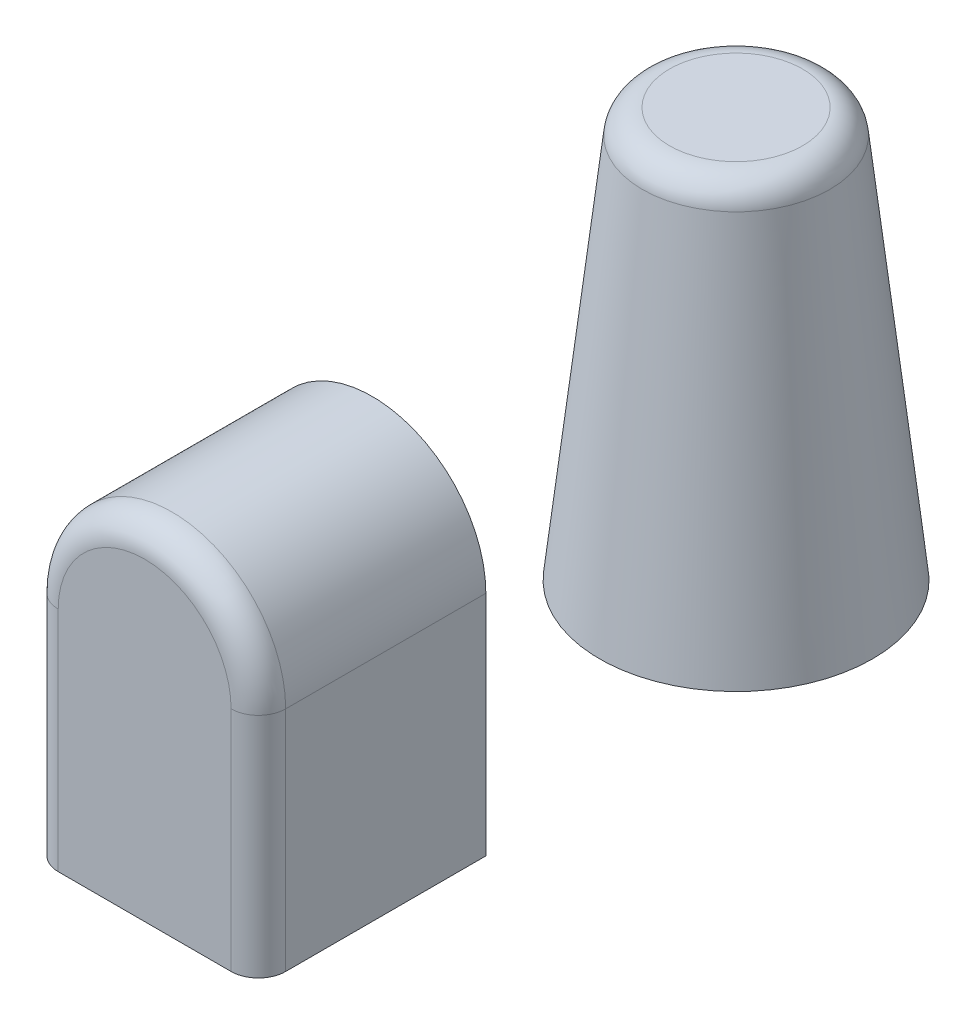
ISO-10303-21;
HEADER;
FILE_DESCRIPTION(('STEP AP214'),'2;1');
FILE_NAME('part.step','',(''),(''),'','','');
FILE_SCHEMA(('AUTOMOTIVE_DESIGN { 1 0 10303 214 1 1 1 1 }'));
ENDSEC;
DATA;
#1=APPLICATION_CONTEXT('core data for automotive mechanical design processes');
#2=APPLICATION_PROTOCOL_DEFINITION('international standard','automotive_design',2000,#1);
#3=PRODUCT_CONTEXT('',#1,'mechanical');
#4=PRODUCT('Part','Part','',(#3));
#5=PRODUCT_RELATED_PRODUCT_CATEGORY('part','',(#4));
#6=PRODUCT_DEFINITION_FORMATION('','',#4);
#7=PRODUCT_DEFINITION_CONTEXT('part definition',#1,'design');
#8=PRODUCT_DEFINITION('design','',#6,#7);
#9=PRODUCT_DEFINITION_SHAPE('','',#8);
#10=(LENGTH_UNIT() NAMED_UNIT(*) SI_UNIT(.MILLI.,.METRE.));
#11=(NAMED_UNIT(*) PLANE_ANGLE_UNIT() SI_UNIT($,.RADIAN.));
#12=(NAMED_UNIT(*) SI_UNIT($,.STERADIAN.) SOLID_ANGLE_UNIT());
#13=UNCERTAINTY_MEASURE_WITH_UNIT(LENGTH_MEASURE(1.E-05),#10,'distance_accuracy_value','');
#14=(GEOMETRIC_REPRESENTATION_CONTEXT(3) GLOBAL_UNCERTAINTY_ASSIGNED_CONTEXT((#13)) GLOBAL_UNIT_ASSIGNED_CONTEXT((#10,
#11,#12)) REPRESENTATION_CONTEXT('',''));
#15=CARTESIAN_POINT('',(0.,0.,0.));
#16=DIRECTION('',(0.,0.,1.));
#17=DIRECTION('',(1.,0.,0.));
#18=AXIS2_PLACEMENT_3D('',#15,#16,#17);
#19=CARTESIAN_POINT('',(0.,25.,65.));
#20=DIRECTION('',(0.,0.,-1.));
#21=DIRECTION('',(-1.,0.,0.));
#22=AXIS2_PLACEMENT_3D('',#19,#20,#21);
#23=CYLINDRICAL_SURFACE('',#22,12.5);
#24=DIRECTION('',(0.,0.,-1.));
#25=VECTOR('',#24,1.);
#26=CARTESIAN_POINT('',(-12.5,25.,65.));
#27=LINE('',#26,#25);
#28=CARTESIAN_POINT('',(-12.5,25.,62.));
#29=VERTEX_POINT('',#28);
#30=CARTESIAN_POINT('',(-12.5,25.,40.));
#31=VERTEX_POINT('',#30);
#32=EDGE_CURVE('E97',#29,#31,#27,.T.);
#33=ORIENTED_EDGE('',*,*,#32,.F.);
#34=CARTESIAN_POINT('',(0.,25.,62.));
#35=DIRECTION('',(0.,0.,-1.));
#36=DIRECTION('',(-1.,0.,0.));
#37=AXIS2_PLACEMENT_3D('',#34,#35,#36);
#38=CIRCLE('',#37,12.5);
#39=CARTESIAN_POINT('',(12.5,25.,62.));
#40=VERTEX_POINT('',#39);
#41=EDGE_CURVE('E12',#29,#40,#38,.T.);
#42=ORIENTED_EDGE('',*,*,#41,.T.);
#43=DIRECTION('',(0.,0.,-1.));
#44=VECTOR('',#43,1.);
#45=CARTESIAN_POINT('',(12.5,25.,65.));
#46=LINE('',#45,#44);
#47=CARTESIAN_POINT('',(12.5,25.,40.));
#48=VERTEX_POINT('',#47);
#49=EDGE_CURVE('E114',#40,#48,#46,.T.);
#50=ORIENTED_EDGE('',*,*,#49,.T.);
#51=CARTESIAN_POINT('',(0.,25.,40.));
#52=DIRECTION('',(0.,0.,1.));
#53=DIRECTION('',(-1.,0.,0.));
#54=AXIS2_PLACEMENT_3D('',#51,#52,#53);
#55=CIRCLE('',#54,12.5);
#56=EDGE_CURVE('E110',#48,#31,#55,.T.);
#57=ORIENTED_EDGE('',*,*,#56,.T.);
#58=EDGE_LOOP('',(#33,#42,#50,#57));
#59=FACE_BOUND('',#58,.T.);
#60=ADVANCED_FACE('F45',(#59),#23,.T.);
#61=CARTESIAN_POINT('',(-12.5,25.,65.));
#62=DIRECTION('',(1.,0.,0.));
#63=DIRECTION('',(0.,1.,0.));
#64=AXIS2_PLACEMENT_3D('',#61,#62,#63);
#65=PLANE('',#64);
#66=DIRECTION('',(0.,0.,-1.));
#67=VECTOR('',#66,1.);
#68=CARTESIAN_POINT('',(-12.5,0.,65.));
#69=LINE('',#68,#67);
#70=CARTESIAN_POINT('',(-12.5,0.,62.));
#71=VERTEX_POINT('',#70);
#72=CARTESIAN_POINT('',(-12.5,0.,40.));
#73=VERTEX_POINT('',#72);
#74=EDGE_CURVE('E104',#71,#73,#69,.T.);
#75=ORIENTED_EDGE('',*,*,#74,.F.);
#76=DIRECTION('',(0.,-1.,0.));
#77=VECTOR('',#76,1.);
#78=CARTESIAN_POINT('',(-12.5,25.,62.));
#79=LINE('',#78,#77);
#80=EDGE_CURVE('E68',#71,#29,#79,.F.);
#81=ORIENTED_EDGE('',*,*,#80,.T.);
#82=ORIENTED_EDGE('',*,*,#32,.T.);
#83=DIRECTION('',(0.,-1.,0.));
#84=VECTOR('',#83,1.);
#85=CARTESIAN_POINT('',(-12.5,25.,40.));
#86=LINE('',#85,#84);
#87=EDGE_CURVE('E100',#31,#73,#86,.T.);
#88=ORIENTED_EDGE('',*,*,#87,.T.);
#89=EDGE_LOOP('',(#75,#81,#82,#88));
#90=FACE_BOUND('',#89,.T.);
#91=ADVANCED_FACE('F99',(#90),#65,.F.);
#92=CARTESIAN_POINT('',(-12.5,0.,65.));
#93=DIRECTION('',(0.,1.,0.));
#94=DIRECTION('',(0.,0.,1.));
#95=AXIS2_PLACEMENT_3D('',#92,#93,#94);
#96=PLANE('',#95);
#97=DIRECTION('',(1.,0.,0.));
#98=VECTOR('',#97,1.);
#99=CARTESIAN_POINT('',(-12.5,0.,65.));
#100=LINE('',#99,#98);
#101=CARTESIAN_POINT('',(-9.5,0.,65.));
#102=VERTEX_POINT('',#101);
#103=CARTESIAN_POINT('',(9.49999999999999,0.,65.));
#104=VERTEX_POINT('',#103);
#105=EDGE_CURVE('E120',#102,#104,#100,.T.);
#106=ORIENTED_EDGE('',*,*,#105,.F.);
#107=CARTESIAN_POINT('',(-9.5,0.,62.));
#108=DIRECTION('',(0.,1.,0.));
#109=DIRECTION('',(0.,0.,1.));
#110=AXIS2_PLACEMENT_3D('',#107,#108,#109);
#111=CIRCLE('',#110,3.);
#112=EDGE_CURVE('E137',#102,#71,#111,.F.);
#113=ORIENTED_EDGE('',*,*,#112,.T.);
#114=ORIENTED_EDGE('',*,*,#74,.T.);
#115=DIRECTION('',(1.,0.,0.));
#116=VECTOR('',#115,1.);
#117=CARTESIAN_POINT('',(-12.5,0.,40.));
#118=LINE('',#117,#116);
#119=CARTESIAN_POINT('',(12.5,0.,40.));
#120=VERTEX_POINT('',#119);
#121=EDGE_CURVE('E112',#73,#120,#118,.T.);
#122=ORIENTED_EDGE('',*,*,#121,.T.);
#123=DIRECTION('',(0.,0.,-1.));
#124=VECTOR('',#123,1.);
#125=CARTESIAN_POINT('',(12.5,0.,65.));
#126=LINE('',#125,#124);
#127=CARTESIAN_POINT('',(12.5,0.,62.));
#128=VERTEX_POINT('',#127);
#129=EDGE_CURVE('E126',#128,#120,#126,.T.);
#130=ORIENTED_EDGE('',*,*,#129,.F.);
#131=CARTESIAN_POINT('',(9.5,0.,62.));
#132=DIRECTION('',(0.,1.,0.));
#133=DIRECTION('',(0.,0.,1.));
#134=AXIS2_PLACEMENT_3D('',#131,#132,#133);
#135=CIRCLE('',#134,3.);
#136=EDGE_CURVE('E135',#128,#104,#135,.F.);
#137=ORIENTED_EDGE('',*,*,#136,.T.);
#138=EDGE_LOOP('',(#106,#113,#114,#122,#130,#137));
#139=FACE_BOUND('',#138,.T.);
#140=ADVANCED_FACE('F158',(#139),#96,.F.);
#141=CARTESIAN_POINT('',(12.5,0.,65.));
#142=DIRECTION('',(-1.,0.,0.));
#143=DIRECTION('',(0.,0.,1.));
#144=AXIS2_PLACEMENT_3D('',#141,#142,#143);
#145=PLANE('',#144);
#146=ORIENTED_EDGE('',*,*,#49,.F.);
#147=DIRECTION('',(0.,1.,0.));
#148=VECTOR('',#147,1.);
#149=CARTESIAN_POINT('',(12.5,0.,62.));
#150=LINE('',#149,#148);
#151=EDGE_CURVE('E54',#40,#128,#150,.F.);
#152=ORIENTED_EDGE('',*,*,#151,.T.);
#153=ORIENTED_EDGE('',*,*,#129,.T.);
#154=DIRECTION('',(0.,1.,0.));
#155=VECTOR('',#154,1.);
#156=CARTESIAN_POINT('',(12.5,0.,40.));
#157=LINE('',#156,#155);
#158=EDGE_CURVE('E123',#120,#48,#157,.T.);
#159=ORIENTED_EDGE('',*,*,#158,.T.);
#160=EDGE_LOOP('',(#146,#152,#153,#159));
#161=FACE_BOUND('',#160,.T.);
#162=ADVANCED_FACE('F155',(#161),#145,.F.);
#163=CARTESIAN_POINT('',(0.,25.,65.));
#164=DIRECTION('',(0.,0.,-1.));
#165=DIRECTION('',(-1.,0.,0.));
#166=AXIS2_PLACEMENT_3D('',#163,#164,#165);
#167=PLANE('',#166);
#168=CARTESIAN_POINT('',(0.,25.,65.));
#169=DIRECTION('',(0.,0.,-1.));
#170=DIRECTION('',(-1.,0.,0.));
#171=AXIS2_PLACEMENT_3D('',#168,#169,#170);
#172=CIRCLE('',#171,9.5);
#173=CARTESIAN_POINT('',(9.5,25.,65.));
#174=VERTEX_POINT('',#173);
#175=CARTESIAN_POINT('',(-9.5,25.,65.));
#176=VERTEX_POINT('',#175);
#177=EDGE_CURVE('E103',#174,#176,#172,.F.);
#178=ORIENTED_EDGE('',*,*,#177,.T.);
#179=DIRECTION('',(0.,-1.,0.));
#180=VECTOR('',#179,1.);
#181=CARTESIAN_POINT('',(-9.5,25.,65.));
#182=LINE('',#181,#180);
#183=EDGE_CURVE('E132',#176,#102,#182,.T.);
#184=ORIENTED_EDGE('',*,*,#183,.T.);
#185=ORIENTED_EDGE('',*,*,#105,.T.);
#186=DIRECTION('',(0.,1.,0.));
#187=VECTOR('',#186,1.);
#188=CARTESIAN_POINT('',(9.5,25.,65.));
#189=LINE('',#188,#187);
#190=EDGE_CURVE('E130',#104,#174,#189,.T.);
#191=ORIENTED_EDGE('',*,*,#190,.T.);
#192=EDGE_LOOP('',(#178,#184,#185,#191));
#193=FACE_BOUND('',#192,.T.);
#194=ADVANCED_FACE('F161',(#193),#167,.F.);
#195=CARTESIAN_POINT('',(0.,25.,40.));
#196=DIRECTION('',(0.,0.,-1.));
#197=DIRECTION('',(-1.,0.,0.));
#198=AXIS2_PLACEMENT_3D('',#195,#196,#197);
#199=PLANE('',#198);
#200=ORIENTED_EDGE('',*,*,#56,.F.);
#201=ORIENTED_EDGE('',*,*,#158,.F.);
#202=ORIENTED_EDGE('',*,*,#121,.F.);
#203=ORIENTED_EDGE('',*,*,#87,.F.);
#204=EDGE_LOOP('',(#200,#201,#202,#203));
#205=FACE_BOUND('',#204,.T.);
#206=ADVANCED_FACE('F108',(#205),#199,.T.);
#207=CARTESIAN_POINT('',(9.5,25.,62.));
#208=DIRECTION('',(0.,1.,0.));
#209=DIRECTION('',(0.,0.,1.));
#210=AXIS2_PLACEMENT_3D('',#207,#208,#209);
#211=CYLINDRICAL_SURFACE('',#210,3.);
#212=ORIENTED_EDGE('',*,*,#136,.F.);
#213=ORIENTED_EDGE('',*,*,#151,.F.);
#214=CARTESIAN_POINT('',(9.5,25.,62.));
#215=DIRECTION('',(0.,1.,0.));
#216=DIRECTION('',(0.,0.,1.));
#217=AXIS2_PLACEMENT_3D('',#214,#215,#216);
#218=CIRCLE('',#217,3.);
#219=EDGE_CURVE('E49',#174,#40,#218,.T.);
#220=ORIENTED_EDGE('',*,*,#219,.F.);
#221=ORIENTED_EDGE('',*,*,#190,.F.);
#222=EDGE_LOOP('',(#212,#213,#220,#221));
#223=FACE_BOUND('',#222,.T.);
#224=ADVANCED_FACE('F47',(#223),#211,.T.);
#225=CARTESIAN_POINT('',(0.,25.,62.));
#226=DIRECTION('',(0.,0.,-1.));
#227=DIRECTION('',(-1.,0.,0.));
#228=AXIS2_PLACEMENT_3D('',#225,#226,#227);
#229=TOROIDAL_SURFACE('',#228,9.5,3.);
#230=ORIENTED_EDGE('',*,*,#219,.T.);
#231=ORIENTED_EDGE('',*,*,#41,.F.);
#232=CARTESIAN_POINT('',(-9.5,25.,62.));
#233=DIRECTION('',(0.,-1.,0.));
#234=DIRECTION('',(1.,0.,0.));
#235=AXIS2_PLACEMENT_3D('',#232,#233,#234);
#236=CIRCLE('',#235,3.);
#237=EDGE_CURVE('E118',#176,#29,#236,.T.);
#238=ORIENTED_EDGE('',*,*,#237,.F.);
#239=ORIENTED_EDGE('',*,*,#177,.F.);
#240=EDGE_LOOP('',(#230,#231,#238,#239));
#241=FACE_BOUND('',#240,.T.);
#242=ADVANCED_FACE('F147',(#241),#229,.T.);
#243=CARTESIAN_POINT('',(-9.5,25.,62.));
#244=DIRECTION('',(0.,-1.,0.));
#245=DIRECTION('',(1.,0.,0.));
#246=AXIS2_PLACEMENT_3D('',#243,#244,#245);
#247=CYLINDRICAL_SURFACE('',#246,3.);
#248=ORIENTED_EDGE('',*,*,#237,.T.);
#249=ORIENTED_EDGE('',*,*,#80,.F.);
#250=ORIENTED_EDGE('',*,*,#112,.F.);
#251=ORIENTED_EDGE('',*,*,#183,.F.);
#252=EDGE_LOOP('',(#248,#249,#250,#251));
#253=FACE_BOUND('',#252,.T.);
#254=ADVANCED_FACE('F144',(#253),#247,.T.);
#255=CLOSED_SHELL('',(#60,#91,#140,#162,#194,#206,#224,#242,#254));
#256=MANIFOLD_SOLID_BREP('B2',#255);
#257=CARTESIAN_POINT('',(0.,0.,0.));
#258=DIRECTION('',(0.,-1.,0.));
#259=DIRECTION('',(1.,0.,0.));
#260=AXIS2_PLACEMENT_3D('',#257,#258,#259);
#261=PLANE('',#260);
#262=CARTESIAN_POINT('',(0.,0.,0.));
#263=DIRECTION('',(0.,-1.,0.));
#264=DIRECTION('',(1.,0.,0.));
#265=AXIS2_PLACEMENT_3D('',#262,#263,#264);
#266=CIRCLE('',#265,15.);
#267=CARTESIAN_POINT('',(15.,0.,0.));
#268=VERTEX_POINT('',#267);
#269=EDGE_CURVE('E44',#268,#268,#266,.T.);
#270=ORIENTED_EDGE('',*,*,#269,.T.);
#271=EDGE_LOOP('',(#270));
#272=FACE_BOUND('',#271,.T.);
#273=ADVANCED_FACE('F235',(#272),#261,.T.);
#274=CARTESIAN_POINT('',(0.,0.,0.));
#275=DIRECTION('',(0.,-1.,0.));
#276=DIRECTION('',(1.,0.,0.));
#277=AXIS2_PLACEMENT_3D('',#274,#275,#276);
#278=CONICAL_SURFACE('',#277,15.,0.110657221173892);
#279=CARTESIAN_POINT('',(-1.45206880848493E-13,42.3312945782245,0.));
#280=DIRECTION('',(0.,-1.,0.));
#281=DIRECTION('',(1.,0.,0.));
#282=AXIS2_PLACEMENT_3D('',#279,#280,#281);
#283=CIRCLE('',#282,10.2965228246419);
#284=CARTESIAN_POINT('',(10.2965228246417,42.3312945782245,0.));
#285=VERTEX_POINT('',#284);
#286=EDGE_CURVE('E241',#285,#285,#283,.T.);
#287=ORIENTED_EDGE('',*,*,#286,.T.);
#288=EDGE_LOOP('',(#287));
#289=FACE_BOUND('',#288,.T.);
#290=ORIENTED_EDGE('',*,*,#269,.F.);
#291=EDGE_LOOP('',(#290));
#292=FACE_BOUND('',#291,.T.);
#293=ADVANCED_FACE('F261',(#289,#292),#278,.T.);
#294=CARTESIAN_POINT('',(-1.43982048506075E-13,42.,0.));
#295=DIRECTION('',(0.,-1.,0.));
#296=DIRECTION('',(1.,0.,0.));
#297=AXIS2_PLACEMENT_3D('',#294,#295,#296);
#298=TOROIDAL_SURFACE('',#297,7.314871620621,3.);
#299=CARTESIAN_POINT('',(-1.54361204949859E-13,45.,0.));
#300=DIRECTION('',(0.,-1.,0.));
#301=DIRECTION('',(1.,0.,0.));
#302=AXIS2_PLACEMENT_3D('',#299,#300,#301);
#303=CIRCLE('',#302,7.314871620621);
#304=CARTESIAN_POINT('',(7.31487162062084,45.,0.));
#305=VERTEX_POINT('',#304);
#306=EDGE_CURVE('E245',#305,#305,#303,.T.);
#307=ORIENTED_EDGE('',*,*,#306,.T.);
#308=EDGE_LOOP('',(#307));
#309=FACE_BOUND('',#308,.T.);
#310=ORIENTED_EDGE('',*,*,#286,.F.);
#311=EDGE_LOOP('',(#310));
#312=FACE_BOUND('',#311,.T.);
#313=ADVANCED_FACE('F252',(#309,#312),#298,.T.);
#314=CARTESIAN_POINT('',(7.31487162062084,45.,0.));
#315=DIRECTION('',(0.,1.,0.));
#316=DIRECTION('',(-1.,0.,0.));
#317=AXIS2_PLACEMENT_3D('',#314,#315,#316);
#318=PLANE('',#317);
#319=ORIENTED_EDGE('',*,*,#306,.F.);
#320=EDGE_LOOP('',(#319));
#321=FACE_BOUND('',#320,.T.);
#322=ADVANCED_FACE('F255',(#321),#318,.T.);
#323=CLOSED_SHELL('',(#273,#293,#313,#322));
#324=MANIFOLD_SOLID_BREP('B6',#323);
#325=ADVANCED_BREP_SHAPE_REPRESENTATION('',(#18,#256,#324),#14);
#326=SHAPE_DEFINITION_REPRESENTATION(#9,#325);
ENDSEC;
END-ISO-10303-21;
